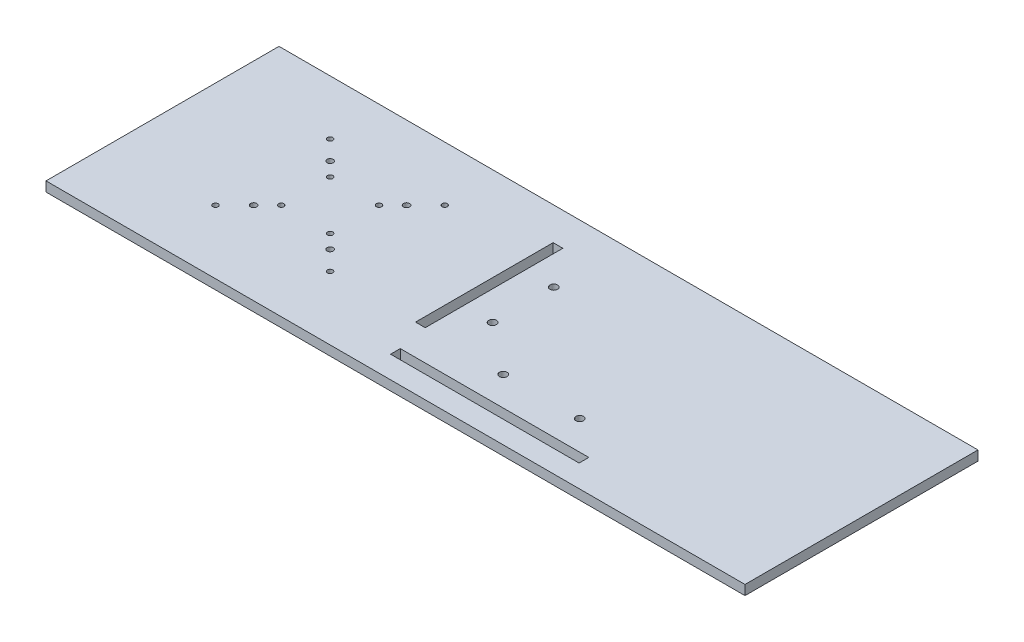
ISO-10303-21;
HEADER;
FILE_DESCRIPTION(('STEP AP214'),'2;1');
FILE_NAME('part.step','',(''),(''),'','','');
FILE_SCHEMA(('AUTOMOTIVE_DESIGN { 1 0 10303 214 1 1 1 1 }'));
ENDSEC;
DATA;
#1=APPLICATION_CONTEXT('core data for automotive mechanical design processes');
#2=APPLICATION_PROTOCOL_DEFINITION('international standard','automotive_design',2000,#1);
#3=PRODUCT_CONTEXT('',#1,'mechanical');
#4=PRODUCT('Part','Part','',(#3));
#5=PRODUCT_RELATED_PRODUCT_CATEGORY('part','',(#4));
#6=PRODUCT_DEFINITION_FORMATION('','',#4);
#7=PRODUCT_DEFINITION_CONTEXT('part definition',#1,'design');
#8=PRODUCT_DEFINITION('design','',#6,#7);
#9=PRODUCT_DEFINITION_SHAPE('','',#8);
#10=(LENGTH_UNIT() NAMED_UNIT(*) SI_UNIT(.MILLI.,.METRE.));
#11=(NAMED_UNIT(*) PLANE_ANGLE_UNIT() SI_UNIT($,.RADIAN.));
#12=(NAMED_UNIT(*) SI_UNIT($,.STERADIAN.) SOLID_ANGLE_UNIT());
#13=UNCERTAINTY_MEASURE_WITH_UNIT(LENGTH_MEASURE(1.E-05),#10,'distance_accuracy_value','');
#14=(GEOMETRIC_REPRESENTATION_CONTEXT(3) GLOBAL_UNCERTAINTY_ASSIGNED_CONTEXT((#13)) GLOBAL_UNIT_ASSIGNED_CONTEXT((#10,
#11,#12)) REPRESENTATION_CONTEXT('',''));
#15=CARTESIAN_POINT('',(0.,0.,0.));
#16=DIRECTION('',(0.,0.,1.));
#17=DIRECTION('',(1.,0.,0.));
#18=AXIS2_PLACEMENT_3D('',#15,#16,#17);
#19=CARTESIAN_POINT('',(0.,6.35,0.));
#20=DIRECTION('',(0.,-1.,0.));
#21=DIRECTION('',(0.,0.,-1.));
#22=AXIS2_PLACEMENT_3D('',#19,#20,#21);
#23=PLANE('',#22);
#24=CARTESIAN_POINT('',(69.2025812842571,6.35,-41.6299999999999));
#25=DIRECTION('',(0.,1.,0.));
#26=DIRECTION('',(0.,0.,1.));
#27=AXIS2_PLACEMENT_3D('',#24,#25,#26);
#28=CIRCLE('',#27,1.74999999999944);
#29=CARTESIAN_POINT('',(69.2025812842571,6.35,-39.8800000000005));
#30=VERTEX_POINT('',#29);
#31=EDGE_CURVE('E180',#30,#30,#28,.T.);
#32=ORIENTED_EDGE('',*,*,#31,.F.);
#33=EDGE_LOOP('',(#32));
#34=FACE_BOUND('',#33,.T.);
#35=CARTESIAN_POINT('',(144.202581284257,6.35,-41.6299999999999));
#36=DIRECTION('',(0.,1.,0.));
#37=DIRECTION('',(0.,0.,1.));
#38=AXIS2_PLACEMENT_3D('',#35,#36,#37);
#39=CIRCLE('',#38,1.74999999999946);
#40=CARTESIAN_POINT('',(144.202581284257,6.35,-39.8800000000005));
#41=VERTEX_POINT('',#40);
#42=EDGE_CURVE('E188',#41,#41,#39,.T.);
#43=ORIENTED_EDGE('',*,*,#42,.F.);
#44=EDGE_LOOP('',(#43));
#45=FACE_BOUND('',#44,.T.);
#46=CARTESIAN_POINT('',(69.202581284257,6.35,-116.63));
#47=DIRECTION('',(0.,1.,0.));
#48=DIRECTION('',(0.,0.,1.));
#49=AXIS2_PLACEMENT_3D('',#46,#47,#48);
#50=CIRCLE('',#49,1.74999999999926);
#51=CARTESIAN_POINT('',(69.202581284257,6.35,-114.88));
#52=VERTEX_POINT('',#51);
#53=EDGE_CURVE('E196',#52,#52,#50,.T.);
#54=ORIENTED_EDGE('',*,*,#53,.F.);
#55=EDGE_LOOP('',(#54));
#56=FACE_BOUND('',#55,.T.);
#57=CARTESIAN_POINT('',(144.202581284257,6.35,-116.63));
#58=DIRECTION('',(0.,1.,0.));
#59=DIRECTION('',(0.,0.,1.));
#60=AXIS2_PLACEMENT_3D('',#57,#58,#59);
#61=CIRCLE('',#60,1.74999999999949);
#62=CARTESIAN_POINT('',(144.202581284257,6.35,-114.88));
#63=VERTEX_POINT('',#62);
#64=EDGE_CURVE('E204',#63,#63,#61,.T.);
#65=ORIENTED_EDGE('',*,*,#64,.F.);
#66=EDGE_LOOP('',(#65));
#67=FACE_BOUND('',#66,.T.);
#68=DIRECTION('',(0.,0.,1.));
#69=VECTOR('',#68,1.);
#70=CARTESIAN_POINT('',(200.85,6.35,-130.86));
#71=LINE('',#70,#69);
#72=CARTESIAN_POINT('',(200.85,6.35,-130.86));
#73=VERTEX_POINT('',#72);
#74=CARTESIAN_POINT('',(200.85,6.35,-40.8600000000001));
#75=VERTEX_POINT('',#74);
#76=EDGE_CURVE('E212',#73,#75,#71,.T.);
#77=ORIENTED_EDGE('',*,*,#76,.F.);
#78=DIRECTION('',(-1.,0.,0.));
#79=VECTOR('',#78,1.);
#80=CARTESIAN_POINT('',(207.2,6.35,-130.86));
#81=LINE('',#80,#79);
#82=CARTESIAN_POINT('',(207.2,6.35,-130.86));
#83=VERTEX_POINT('',#82);
#84=EDGE_CURVE('E223',#83,#73,#81,.T.);
#85=ORIENTED_EDGE('',*,*,#84,.F.);
#86=DIRECTION('',(0.,0.,-1.));
#87=VECTOR('',#86,1.);
#88=CARTESIAN_POINT('',(207.2,6.35,-130.86));
#89=LINE('',#88,#87);
#90=CARTESIAN_POINT('',(207.2,6.35,-40.8600000000001));
#91=VERTEX_POINT('',#90);
#92=EDGE_CURVE('E219',#91,#83,#89,.T.);
#93=ORIENTED_EDGE('',*,*,#92,.F.);
#94=DIRECTION('',(1.,0.,0.));
#95=VECTOR('',#94,1.);
#96=CARTESIAN_POINT('',(207.2,6.35,-40.8600000000001));
#97=LINE('',#96,#95);
#98=EDGE_CURVE('E215',#75,#91,#97,.T.);
#99=ORIENTED_EDGE('',*,*,#98,.F.);
#100=EDGE_LOOP('',(#77,#85,#93,#99));
#101=FACE_BOUND('',#100,.T.);
#102=DIRECTION('',(0.,0.,1.));
#103=VECTOR('',#102,1.);
#104=CARTESIAN_POINT('',(0.,6.35,0.));
#105=LINE('',#104,#103);
#106=CARTESIAN_POINT('',(0.,6.35,-152.4));
#107=VERTEX_POINT('',#106);
#108=CARTESIAN_POINT('',(0.,6.35,0.));
#109=VERTEX_POINT('',#108);
#110=EDGE_CURVE('E287',#107,#109,#105,.T.);
#111=ORIENTED_EDGE('',*,*,#110,.T.);
#112=DIRECTION('',(1.,0.,0.));
#113=VECTOR('',#112,1.);
#114=CARTESIAN_POINT('',(0.,6.35,0.));
#115=LINE('',#114,#113);
#116=CARTESIAN_POINT('',(457.2,6.35,0.));
#117=VERTEX_POINT('',#116);
#118=EDGE_CURVE('E291',#109,#117,#115,.T.);
#119=ORIENTED_EDGE('',*,*,#118,.T.);
#120=DIRECTION('',(0.,0.,-1.));
#121=VECTOR('',#120,1.);
#122=CARTESIAN_POINT('',(457.2,6.35,0.));
#123=LINE('',#122,#121);
#124=CARTESIAN_POINT('',(457.2,6.35,-152.4));
#125=VERTEX_POINT('',#124);
#126=EDGE_CURVE('E295',#117,#125,#123,.T.);
#127=ORIENTED_EDGE('',*,*,#126,.T.);
#128=DIRECTION('',(-1.,0.,0.));
#129=VECTOR('',#128,1.);
#130=CARTESIAN_POINT('',(0.,6.35,-152.4));
#131=LINE('',#130,#129);
#132=EDGE_CURVE('E298',#125,#107,#131,.T.);
#133=ORIENTED_EDGE('',*,*,#132,.T.);
#134=EDGE_LOOP('',(#111,#119,#127,#133));
#135=FACE_BOUND('',#134,.T.);
#136=CARTESIAN_POINT('',(90.702581284257,6.35,-95.13));
#137=DIRECTION('',(0.,1.,0.));
#138=DIRECTION('',(0.,0.,1.));
#139=AXIS2_PLACEMENT_3D('',#136,#137,#138);
#140=CIRCLE('',#139,1.74999999999946);
#141=CARTESIAN_POINT('',(90.702581284257,6.35,-93.3800000000005));
#142=VERTEX_POINT('',#141);
#143=EDGE_CURVE('E279',#142,#142,#140,.T.);
#144=ORIENTED_EDGE('',*,*,#143,.F.);
#145=EDGE_LOOP('',(#144));
#146=FACE_BOUND('',#145,.T.);
#147=CARTESIAN_POINT('',(122.702581284257,6.35,-95.1299999999999));
#148=DIRECTION('',(0.,1.,0.));
#149=DIRECTION('',(0.,0.,1.));
#150=AXIS2_PLACEMENT_3D('',#147,#148,#149);
#151=CIRCLE('',#150,1.74999999999952);
#152=CARTESIAN_POINT('',(122.702581284257,6.35,-93.3800000000003));
#153=VERTEX_POINT('',#152);
#154=EDGE_CURVE('E271',#153,#153,#151,.T.);
#155=ORIENTED_EDGE('',*,*,#154,.F.);
#156=EDGE_LOOP('',(#155));
#157=FACE_BOUND('',#156,.T.);
#158=CARTESIAN_POINT('',(122.702581284257,6.35,-63.13));
#159=DIRECTION('',(0.,1.,0.));
#160=DIRECTION('',(0.,0.,1.));
#161=AXIS2_PLACEMENT_3D('',#158,#159,#160);
#162=CIRCLE('',#161,1.74999999999975);
#163=CARTESIAN_POINT('',(122.702581284257,6.35,-61.3800000000002));
#164=VERTEX_POINT('',#163);
#165=EDGE_CURVE('E263',#164,#164,#162,.T.);
#166=ORIENTED_EDGE('',*,*,#165,.F.);
#167=EDGE_LOOP('',(#166));
#168=FACE_BOUND('',#167,.T.);
#169=CARTESIAN_POINT('',(90.702581284257,6.35,-63.1300000000001));
#170=DIRECTION('',(0.,1.,0.));
#171=DIRECTION('',(0.,0.,1.));
#172=AXIS2_PLACEMENT_3D('',#169,#170,#171);
#173=CIRCLE('',#172,1.74999999999969);
#174=CARTESIAN_POINT('',(90.702581284257,6.35,-61.3800000000004));
#175=VERTEX_POINT('',#174);
#176=EDGE_CURVE('E255',#175,#175,#173,.T.);
#177=ORIENTED_EDGE('',*,*,#176,.F.);
#178=EDGE_LOOP('',(#177));
#179=FACE_BOUND('',#178,.T.);
#180=DIRECTION('',(0.,0.,1.));
#181=VECTOR('',#180,1.);
#182=CARTESIAN_POINT('',(210.85,6.35,-20.8600000000001));
#183=LINE('',#182,#181);
#184=CARTESIAN_POINT('',(210.85,6.35,-20.8600000000001));
#185=VERTEX_POINT('',#184);
#186=CARTESIAN_POINT('',(210.85,6.35,-14.5100000000001));
#187=VERTEX_POINT('',#186);
#188=EDGE_CURVE('E129',#185,#187,#183,.T.);
#189=ORIENTED_EDGE('',*,*,#188,.F.);
#190=DIRECTION('',(-1.,0.,0.));
#191=VECTOR('',#190,1.);
#192=CARTESIAN_POINT('',(210.85,6.35,-20.8600000000001));
#193=LINE('',#192,#191);
#194=CARTESIAN_POINT('',(334.17,6.35,-20.8600000000001));
#195=VERTEX_POINT('',#194);
#196=EDGE_CURVE('E156',#195,#185,#193,.T.);
#197=ORIENTED_EDGE('',*,*,#196,.F.);
#198=DIRECTION('',(0.,0.,-1.));
#199=VECTOR('',#198,1.);
#200=CARTESIAN_POINT('',(334.17,6.35,-20.8600000000001));
#201=LINE('',#200,#199);
#202=CARTESIAN_POINT('',(334.17,6.35,-14.5100000000001));
#203=VERTEX_POINT('',#202);
#204=EDGE_CURVE('E152',#203,#195,#201,.T.);
#205=ORIENTED_EDGE('',*,*,#204,.F.);
#206=DIRECTION('',(1.,0.,0.));
#207=VECTOR('',#206,1.);
#208=CARTESIAN_POINT('',(210.85,6.35,-14.5100000000001));
#209=LINE('',#208,#207);
#210=EDGE_CURVE('E138',#187,#203,#209,.T.);
#211=ORIENTED_EDGE('',*,*,#210,.F.);
#212=EDGE_LOOP('',(#189,#197,#205,#211));
#213=FACE_BOUND('',#212,.T.);
#214=CARTESIAN_POINT('',(226.25,6.35,-65.8600000000001));
#215=DIRECTION('',(0.,1.,0.));
#216=DIRECTION('',(0.,0.,1.));
#217=AXIS2_PLACEMENT_3D('',#214,#215,#216);
#218=CIRCLE('',#217,2.50000000000014);
#219=CARTESIAN_POINT('',(226.25,6.35,-63.3599999999999));
#220=VERTEX_POINT('',#219);
#221=EDGE_CURVE('E164',#220,#220,#218,.T.);
#222=ORIENTED_EDGE('',*,*,#221,.F.);
#223=EDGE_LOOP('',(#222));
#224=FACE_BOUND('',#223,.T.);
#225=CARTESIAN_POINT('',(226.25,6.35,-105.86));
#226=DIRECTION('',(0.,1.,0.));
#227=DIRECTION('',(0.,0.,1.));
#228=AXIS2_PLACEMENT_3D('',#225,#226,#227);
#229=CIRCLE('',#228,2.50000000000014);
#230=CARTESIAN_POINT('',(226.25,6.35,-103.36));
#231=VERTEX_POINT('',#230);
#232=EDGE_CURVE('E459',#231,#231,#229,.T.);
#233=ORIENTED_EDGE('',*,*,#232,.F.);
#234=EDGE_LOOP('',(#233));
#235=FACE_BOUND('',#234,.T.);
#236=CARTESIAN_POINT('',(259.17,6.35,-39.9100000000001));
#237=DIRECTION('',(0.,1.,0.));
#238=DIRECTION('',(0.,0.,1.));
#239=AXIS2_PLACEMENT_3D('',#236,#237,#238);
#240=CIRCLE('',#239,2.50000000000002);
#241=CARTESIAN_POINT('',(259.17,6.35,-37.41));
#242=VERTEX_POINT('',#241);
#243=EDGE_CURVE('E452',#242,#242,#240,.T.);
#244=ORIENTED_EDGE('',*,*,#243,.F.);
#245=EDGE_LOOP('',(#244));
#246=FACE_BOUND('',#245,.T.);
#247=CARTESIAN_POINT('',(309.17,6.35,-39.9100000000001));
#248=DIRECTION('',(0.,1.,0.));
#249=DIRECTION('',(0.,0.,1.));
#250=AXIS2_PLACEMENT_3D('',#247,#248,#249);
#251=CIRCLE('',#250,2.50000000000002);
#252=CARTESIAN_POINT('',(309.17,6.35,-37.41));
#253=VERTEX_POINT('',#252);
#254=EDGE_CURVE('E445',#253,#253,#251,.T.);
#255=ORIENTED_EDGE('',*,*,#254,.F.);
#256=EDGE_LOOP('',(#255));
#257=FACE_BOUND('',#256,.T.);
#258=CARTESIAN_POINT('',(81.702581284257,6.35,-104.13));
#259=DIRECTION('',(0.,1.,0.));
#260=DIRECTION('',(0.,0.,1.));
#261=AXIS2_PLACEMENT_3D('',#258,#259,#260);
#262=CIRCLE('',#261,2.);
#263=CARTESIAN_POINT('',(81.702581284257,6.35,-102.13));
#264=VERTEX_POINT('',#263);
#265=EDGE_CURVE('E438',#264,#264,#262,.T.);
#266=ORIENTED_EDGE('',*,*,#265,.F.);
#267=EDGE_LOOP('',(#266));
#268=FACE_BOUND('',#267,.T.);
#269=CARTESIAN_POINT('',(131.702581284257,6.35,-104.13));
#270=DIRECTION('',(0.,1.,0.));
#271=DIRECTION('',(0.,0.,1.));
#272=AXIS2_PLACEMENT_3D('',#269,#270,#271);
#273=CIRCLE('',#272,2.);
#274=CARTESIAN_POINT('',(131.702581284257,6.35,-102.13));
#275=VERTEX_POINT('',#274);
#276=EDGE_CURVE('E431',#275,#275,#273,.T.);
#277=ORIENTED_EDGE('',*,*,#276,.F.);
#278=EDGE_LOOP('',(#277));
#279=FACE_BOUND('',#278,.T.);
#280=CARTESIAN_POINT('',(131.702581284257,6.35,-54.1299999999999));
#281=DIRECTION('',(0.,1.,0.));
#282=DIRECTION('',(0.,0.,1.));
#283=AXIS2_PLACEMENT_3D('',#280,#281,#282);
#284=CIRCLE('',#283,2.);
#285=CARTESIAN_POINT('',(131.702581284257,6.35,-52.1299999999999));
#286=VERTEX_POINT('',#285);
#287=EDGE_CURVE('E424',#286,#286,#284,.T.);
#288=ORIENTED_EDGE('',*,*,#287,.F.);
#289=EDGE_LOOP('',(#288));
#290=FACE_BOUND('',#289,.T.);
#291=CARTESIAN_POINT('',(81.7025812842575,6.35,-54.1299999999999));
#292=DIRECTION('',(0.,1.,0.));
#293=DIRECTION('',(0.,0.,1.));
#294=AXIS2_PLACEMENT_3D('',#291,#292,#293);
#295=CIRCLE('',#294,2.);
#296=CARTESIAN_POINT('',(81.7025812842575,6.35,-52.1299999999999));
#297=VERTEX_POINT('',#296);
#298=EDGE_CURVE('E417',#297,#297,#295,.T.);
#299=ORIENTED_EDGE('',*,*,#298,.F.);
#300=EDGE_LOOP('',(#299));
#301=FACE_BOUND('',#300,.T.);
#302=ADVANCED_FACE('F39',(#34,#45,#56,#67,#101,#135,#146,#157,#168,#179,#213,#224,#235,#246,
#257,#268,#279,#290,#301),#23,.F.);
#303=CARTESIAN_POINT('',(0.,0.,0.));
#304=DIRECTION('',(0.,-1.,0.));
#305=DIRECTION('',(0.,0.,-1.));
#306=AXIS2_PLACEMENT_3D('',#303,#304,#305);
#307=PLANE('',#306);
#308=CARTESIAN_POINT('',(131.702581284257,0.,-54.1299999999999));
#309=DIRECTION('',(0.,1.,0.));
#310=DIRECTION('',(0.,0.,1.));
#311=AXIS2_PLACEMENT_3D('',#308,#309,#310);
#312=CIRCLE('',#311,2.);
#313=CARTESIAN_POINT('',(131.702581284257,0.,-52.1299999999999));
#314=VERTEX_POINT('',#313);
#315=EDGE_CURVE('E421',#314,#314,#312,.T.);
#316=ORIENTED_EDGE('',*,*,#315,.T.);
#317=EDGE_LOOP('',(#316));
#318=FACE_BOUND('',#317,.T.);
#319=CARTESIAN_POINT('',(81.702581284257,0.,-104.13));
#320=DIRECTION('',(0.,1.,0.));
#321=DIRECTION('',(0.,0.,1.));
#322=AXIS2_PLACEMENT_3D('',#319,#320,#321);
#323=CIRCLE('',#322,2.);
#324=CARTESIAN_POINT('',(81.702581284257,0.,-102.13));
#325=VERTEX_POINT('',#324);
#326=EDGE_CURVE('E435',#325,#325,#323,.T.);
#327=ORIENTED_EDGE('',*,*,#326,.T.);
#328=EDGE_LOOP('',(#327));
#329=FACE_BOUND('',#328,.T.);
#330=CARTESIAN_POINT('',(259.17,0.,-39.9100000000001));
#331=DIRECTION('',(0.,1.,0.));
#332=DIRECTION('',(0.,0.,1.));
#333=AXIS2_PLACEMENT_3D('',#330,#331,#332);
#334=CIRCLE('',#333,2.50000000000002);
#335=CARTESIAN_POINT('',(259.17,0.,-37.41));
#336=VERTEX_POINT('',#335);
#337=EDGE_CURVE('E449',#336,#336,#334,.T.);
#338=ORIENTED_EDGE('',*,*,#337,.T.);
#339=EDGE_LOOP('',(#338));
#340=FACE_BOUND('',#339,.T.);
#341=CARTESIAN_POINT('',(226.25,0.,-65.8600000000001));
#342=DIRECTION('',(0.,1.,0.));
#343=DIRECTION('',(0.,0.,1.));
#344=AXIS2_PLACEMENT_3D('',#341,#342,#343);
#345=CIRCLE('',#344,2.50000000000014);
#346=CARTESIAN_POINT('',(226.25,0.,-63.3599999999999));
#347=VERTEX_POINT('',#346);
#348=EDGE_CURVE('E463',#347,#347,#345,.T.);
#349=ORIENTED_EDGE('',*,*,#348,.T.);
#350=EDGE_LOOP('',(#349));
#351=FACE_BOUND('',#350,.T.);
#352=CARTESIAN_POINT('',(144.202581284257,0.,-41.6299999999999));
#353=DIRECTION('',(0.,1.,0.));
#354=DIRECTION('',(0.,0.,1.));
#355=AXIS2_PLACEMENT_3D('',#352,#353,#354);
#356=CIRCLE('',#355,1.74999999999946);
#357=CARTESIAN_POINT('',(144.202581284257,0.,-39.8800000000005));
#358=VERTEX_POINT('',#357);
#359=EDGE_CURVE('E184',#358,#358,#356,.T.);
#360=ORIENTED_EDGE('',*,*,#359,.T.);
#361=EDGE_LOOP('',(#360));
#362=FACE_BOUND('',#361,.T.);
#363=CARTESIAN_POINT('',(144.202581284257,0.,-116.63));
#364=DIRECTION('',(0.,1.,0.));
#365=DIRECTION('',(0.,0.,1.));
#366=AXIS2_PLACEMENT_3D('',#363,#364,#365);
#367=CIRCLE('',#366,1.74999999999949);
#368=CARTESIAN_POINT('',(144.202581284257,0.,-114.88));
#369=VERTEX_POINT('',#368);
#370=EDGE_CURVE('E200',#369,#369,#367,.T.);
#371=ORIENTED_EDGE('',*,*,#370,.T.);
#372=EDGE_LOOP('',(#371));
#373=FACE_BOUND('',#372,.T.);
#374=CARTESIAN_POINT('',(122.702581284257,0.,-63.13));
#375=DIRECTION('',(0.,1.,0.));
#376=DIRECTION('',(0.,0.,1.));
#377=AXIS2_PLACEMENT_3D('',#374,#375,#376);
#378=CIRCLE('',#377,1.74999999999975);
#379=CARTESIAN_POINT('',(122.702581284257,0.,-61.3800000000002));
#380=VERTEX_POINT('',#379);
#381=EDGE_CURVE('E259',#380,#380,#378,.T.);
#382=ORIENTED_EDGE('',*,*,#381,.T.);
#383=EDGE_LOOP('',(#382));
#384=FACE_BOUND('',#383,.T.);
#385=CARTESIAN_POINT('',(90.702581284257,0.,-95.13));
#386=DIRECTION('',(0.,1.,0.));
#387=DIRECTION('',(0.,0.,1.));
#388=AXIS2_PLACEMENT_3D('',#385,#386,#387);
#389=CIRCLE('',#388,1.74999999999946);
#390=CARTESIAN_POINT('',(90.702581284257,0.,-93.3800000000005));
#391=VERTEX_POINT('',#390);
#392=EDGE_CURVE('E275',#391,#391,#389,.T.);
#393=ORIENTED_EDGE('',*,*,#392,.T.);
#394=EDGE_LOOP('',(#393));
#395=FACE_BOUND('',#394,.T.);
#396=DIRECTION('',(0.,0.,1.));
#397=VECTOR('',#396,1.);
#398=CARTESIAN_POINT('',(0.,0.,0.));
#399=LINE('',#398,#397);
#400=CARTESIAN_POINT('',(0.,0.,-152.4));
#401=VERTEX_POINT('',#400);
#402=CARTESIAN_POINT('',(0.,0.,0.));
#403=VERTEX_POINT('',#402);
#404=EDGE_CURVE('E283',#401,#403,#399,.T.);
#405=ORIENTED_EDGE('',*,*,#404,.F.);
#406=DIRECTION('',(-1.,0.,0.));
#407=VECTOR('',#406,1.);
#408=CARTESIAN_POINT('',(0.,0.,-152.4));
#409=LINE('',#408,#407);
#410=CARTESIAN_POINT('',(457.2,0.,-152.4));
#411=VERTEX_POINT('',#410);
#412=EDGE_CURVE('E292',#411,#401,#409,.T.);
#413=ORIENTED_EDGE('',*,*,#412,.F.);
#414=DIRECTION('',(0.,0.,-1.));
#415=VECTOR('',#414,1.);
#416=CARTESIAN_POINT('',(457.2,0.,0.));
#417=LINE('',#416,#415);
#418=CARTESIAN_POINT('',(457.2,0.,0.));
#419=VERTEX_POINT('',#418);
#420=EDGE_CURVE('E308',#419,#411,#417,.T.);
#421=ORIENTED_EDGE('',*,*,#420,.F.);
#422=DIRECTION('',(1.,0.,0.));
#423=VECTOR('',#422,1.);
#424=CARTESIAN_POINT('',(0.,0.,0.));
#425=LINE('',#424,#423);
#426=EDGE_CURVE('E305',#403,#419,#425,.T.);
#427=ORIENTED_EDGE('',*,*,#426,.F.);
#428=EDGE_LOOP('',(#405,#413,#421,#427));
#429=FACE_BOUND('',#428,.T.);
#430=CARTESIAN_POINT('',(122.702581284257,0.,-95.1299999999999));
#431=DIRECTION('',(0.,1.,0.));
#432=DIRECTION('',(0.,0.,1.));
#433=AXIS2_PLACEMENT_3D('',#430,#431,#432);
#434=CIRCLE('',#433,1.74999999999952);
#435=CARTESIAN_POINT('',(122.702581284257,0.,-93.3800000000003));
#436=VERTEX_POINT('',#435);
#437=EDGE_CURVE('E267',#436,#436,#434,.T.);
#438=ORIENTED_EDGE('',*,*,#437,.T.);
#439=EDGE_LOOP('',(#438));
#440=FACE_BOUND('',#439,.T.);
#441=CARTESIAN_POINT('',(90.702581284257,0.,-63.1300000000001));
#442=DIRECTION('',(0.,1.,0.));
#443=DIRECTION('',(0.,0.,1.));
#444=AXIS2_PLACEMENT_3D('',#441,#442,#443);
#445=CIRCLE('',#444,1.74999999999969);
#446=CARTESIAN_POINT('',(90.702581284257,0.,-61.3800000000004));
#447=VERTEX_POINT('',#446);
#448=EDGE_CURVE('E254',#447,#447,#445,.T.);
#449=ORIENTED_EDGE('',*,*,#448,.T.);
#450=EDGE_LOOP('',(#449));
#451=FACE_BOUND('',#450,.T.);
#452=DIRECTION('',(-1.,0.,0.));
#453=VECTOR('',#452,1.);
#454=CARTESIAN_POINT('',(207.2,0.,-130.86));
#455=LINE('',#454,#453);
#456=CARTESIAN_POINT('',(207.2,0.,-130.86));
#457=VERTEX_POINT('',#456);
#458=CARTESIAN_POINT('',(200.85,0.,-130.86));
#459=VERTEX_POINT('',#458);
#460=EDGE_CURVE('E216',#457,#459,#455,.T.);
#461=ORIENTED_EDGE('',*,*,#460,.T.);
#462=DIRECTION('',(0.,0.,1.));
#463=VECTOR('',#462,1.);
#464=CARTESIAN_POINT('',(200.85,0.,-130.86));
#465=LINE('',#464,#463);
#466=CARTESIAN_POINT('',(200.85,0.,-40.8600000000001));
#467=VERTEX_POINT('',#466);
#468=EDGE_CURVE('E208',#459,#467,#465,.T.);
#469=ORIENTED_EDGE('',*,*,#468,.T.);
#470=DIRECTION('',(1.,0.,0.));
#471=VECTOR('',#470,1.);
#472=CARTESIAN_POINT('',(207.2,0.,-40.8600000000001));
#473=LINE('',#472,#471);
#474=CARTESIAN_POINT('',(207.2,0.,-40.8600000000001));
#475=VERTEX_POINT('',#474);
#476=EDGE_CURVE('E230',#467,#475,#473,.T.);
#477=ORIENTED_EDGE('',*,*,#476,.T.);
#478=DIRECTION('',(0.,0.,-1.));
#479=VECTOR('',#478,1.);
#480=CARTESIAN_POINT('',(207.2,0.,-130.86));
#481=LINE('',#480,#479);
#482=EDGE_CURVE('E234',#475,#457,#481,.T.);
#483=ORIENTED_EDGE('',*,*,#482,.T.);
#484=EDGE_LOOP('',(#461,#469,#477,#483));
#485=FACE_BOUND('',#484,.T.);
#486=CARTESIAN_POINT('',(69.202581284257,0.,-116.63));
#487=DIRECTION('',(0.,1.,0.));
#488=DIRECTION('',(0.,0.,1.));
#489=AXIS2_PLACEMENT_3D('',#486,#487,#488);
#490=CIRCLE('',#489,1.74999999999926);
#491=CARTESIAN_POINT('',(69.202581284257,0.,-114.88));
#492=VERTEX_POINT('',#491);
#493=EDGE_CURVE('E192',#492,#492,#490,.T.);
#494=ORIENTED_EDGE('',*,*,#493,.T.);
#495=EDGE_LOOP('',(#494));
#496=FACE_BOUND('',#495,.T.);
#497=CARTESIAN_POINT('',(69.2025812842571,0.,-41.6299999999999));
#498=DIRECTION('',(0.,1.,0.));
#499=DIRECTION('',(0.,0.,1.));
#500=AXIS2_PLACEMENT_3D('',#497,#498,#499);
#501=CIRCLE('',#500,1.74999999999944);
#502=CARTESIAN_POINT('',(69.2025812842571,0.,-39.8800000000005));
#503=VERTEX_POINT('',#502);
#504=EDGE_CURVE('E147',#503,#503,#501,.T.);
#505=ORIENTED_EDGE('',*,*,#504,.T.);
#506=EDGE_LOOP('',(#505));
#507=FACE_BOUND('',#506,.T.);
#508=DIRECTION('',(-1.,0.,0.));
#509=VECTOR('',#508,1.);
#510=CARTESIAN_POINT('',(210.85,0.,-20.8600000000001));
#511=LINE('',#510,#509);
#512=CARTESIAN_POINT('',(334.17,0.,-20.8600000000001));
#513=VERTEX_POINT('',#512);
#514=CARTESIAN_POINT('',(210.85,0.,-20.8600000000001));
#515=VERTEX_POINT('',#514);
#516=EDGE_CURVE('E139',#513,#515,#511,.T.);
#517=ORIENTED_EDGE('',*,*,#516,.T.);
#518=DIRECTION('',(0.,0.,1.));
#519=VECTOR('',#518,1.);
#520=CARTESIAN_POINT('',(210.85,0.,-20.8600000000001));
#521=LINE('',#520,#519);
#522=CARTESIAN_POINT('',(210.85,0.,-14.5100000000001));
#523=VERTEX_POINT('',#522);
#524=EDGE_CURVE('E63',#515,#523,#521,.T.);
#525=ORIENTED_EDGE('',*,*,#524,.T.);
#526=DIRECTION('',(1.,0.,0.));
#527=VECTOR('',#526,1.);
#528=CARTESIAN_POINT('',(210.85,0.,-14.5100000000001));
#529=LINE('',#528,#527);
#530=CARTESIAN_POINT('',(334.17,0.,-14.5100000000001));
#531=VERTEX_POINT('',#530);
#532=EDGE_CURVE('E145',#523,#531,#529,.T.);
#533=ORIENTED_EDGE('',*,*,#532,.T.);
#534=DIRECTION('',(0.,0.,-1.));
#535=VECTOR('',#534,1.);
#536=CARTESIAN_POINT('',(334.17,0.,-20.8600000000001));
#537=LINE('',#536,#535);
#538=EDGE_CURVE('E167',#531,#513,#537,.T.);
#539=ORIENTED_EDGE('',*,*,#538,.T.);
#540=EDGE_LOOP('',(#517,#525,#533,#539));
#541=FACE_BOUND('',#540,.T.);
#542=CARTESIAN_POINT('',(226.25,0.,-105.86));
#543=DIRECTION('',(0.,1.,0.));
#544=DIRECTION('',(0.,0.,1.));
#545=AXIS2_PLACEMENT_3D('',#542,#543,#544);
#546=CIRCLE('',#545,2.50000000000014);
#547=CARTESIAN_POINT('',(226.25,0.,-103.36));
#548=VERTEX_POINT('',#547);
#549=EDGE_CURVE('E403',#548,#548,#546,.T.);
#550=ORIENTED_EDGE('',*,*,#549,.T.);
#551=EDGE_LOOP('',(#550));
#552=FACE_BOUND('',#551,.T.);
#553=CARTESIAN_POINT('',(309.17,0.,-39.9100000000001));
#554=DIRECTION('',(0.,1.,0.));
#555=DIRECTION('',(0.,0.,1.));
#556=AXIS2_PLACEMENT_3D('',#553,#554,#555);
#557=CIRCLE('',#556,2.50000000000002);
#558=CARTESIAN_POINT('',(309.17,0.,-37.41));
#559=VERTEX_POINT('',#558);
#560=EDGE_CURVE('E407',#559,#559,#557,.T.);
#561=ORIENTED_EDGE('',*,*,#560,.T.);
#562=EDGE_LOOP('',(#561));
#563=FACE_BOUND('',#562,.T.);
#564=CARTESIAN_POINT('',(131.702581284257,0.,-104.13));
#565=DIRECTION('',(0.,1.,0.));
#566=DIRECTION('',(0.,0.,1.));
#567=AXIS2_PLACEMENT_3D('',#564,#565,#566);
#568=CIRCLE('',#567,2.);
#569=CARTESIAN_POINT('',(131.702581284257,0.,-102.13));
#570=VERTEX_POINT('',#569);
#571=EDGE_CURVE('E411',#570,#570,#568,.T.);
#572=ORIENTED_EDGE('',*,*,#571,.T.);
#573=EDGE_LOOP('',(#572));
#574=FACE_BOUND('',#573,.T.);
#575=CARTESIAN_POINT('',(81.7025812842575,0.,-54.1299999999999));
#576=DIRECTION('',(0.,1.,0.));
#577=DIRECTION('',(0.,0.,1.));
#578=AXIS2_PLACEMENT_3D('',#575,#576,#577);
#579=CIRCLE('',#578,2.);
#580=CARTESIAN_POINT('',(81.7025812842575,0.,-52.1299999999999));
#581=VERTEX_POINT('',#580);
#582=EDGE_CURVE('E414',#581,#581,#579,.T.);
#583=ORIENTED_EDGE('',*,*,#582,.T.);
#584=EDGE_LOOP('',(#583));
#585=FACE_BOUND('',#584,.T.);
#586=ADVANCED_FACE('F331',(#318,#329,#340,#351,#362,#373,#384,#395,#429,#440,#451,#485,#496,
#507,#541,#552,#563,#574,#585),#307,.T.);
#587=CARTESIAN_POINT('',(0.,6.35,0.));
#588=DIRECTION('',(1.,0.,0.));
#589=DIRECTION('',(0.,0.,-1.));
#590=AXIS2_PLACEMENT_3D('',#587,#588,#589);
#591=PLANE('',#590);
#592=ORIENTED_EDGE('',*,*,#404,.T.);
#593=DIRECTION('',(0.,-1.,0.));
#594=VECTOR('',#593,1.);
#595=CARTESIAN_POINT('',(0.,6.35,0.));
#596=LINE('',#595,#594);
#597=EDGE_CURVE('E11',#109,#403,#596,.T.);
#598=ORIENTED_EDGE('',*,*,#597,.F.);
#599=ORIENTED_EDGE('',*,*,#110,.F.);
#600=DIRECTION('',(0.,-1.,0.));
#601=VECTOR('',#600,1.);
#602=CARTESIAN_POINT('',(0.,6.35,-152.4));
#603=LINE('',#602,#601);
#604=EDGE_CURVE('E301',#107,#401,#603,.T.);
#605=ORIENTED_EDGE('',*,*,#604,.T.);
#606=EDGE_LOOP('',(#592,#598,#599,#605));
#607=FACE_BOUND('',#606,.T.);
#608=ADVANCED_FACE('F41',(#607),#591,.F.);
#609=CARTESIAN_POINT('',(0.,6.35,0.));
#610=DIRECTION('',(0.,0.,-1.));
#611=DIRECTION('',(-1.,0.,0.));
#612=AXIS2_PLACEMENT_3D('',#609,#610,#611);
#613=PLANE('',#612);
#614=ORIENTED_EDGE('',*,*,#426,.T.);
#615=DIRECTION('',(0.,-1.,0.));
#616=VECTOR('',#615,1.);
#617=CARTESIAN_POINT('',(457.2,6.35,0.));
#618=LINE('',#617,#616);
#619=EDGE_CURVE('E48',#117,#419,#618,.T.);
#620=ORIENTED_EDGE('',*,*,#619,.F.);
#621=ORIENTED_EDGE('',*,*,#118,.F.);
#622=ORIENTED_EDGE('',*,*,#597,.T.);
#623=EDGE_LOOP('',(#614,#620,#621,#622));
#624=FACE_BOUND('',#623,.T.);
#625=ADVANCED_FACE('F342',(#624),#613,.F.);
#626=CARTESIAN_POINT('',(457.2,6.35,0.));
#627=DIRECTION('',(-1.,0.,0.));
#628=DIRECTION('',(0.,0.,1.));
#629=AXIS2_PLACEMENT_3D('',#626,#627,#628);
#630=PLANE('',#629);
#631=ORIENTED_EDGE('',*,*,#420,.T.);
#632=DIRECTION('',(0.,-1.,0.));
#633=VECTOR('',#632,1.);
#634=CARTESIAN_POINT('',(457.2,6.35,-152.4));
#635=LINE('',#634,#633);
#636=EDGE_CURVE('E316',#125,#411,#635,.T.);
#637=ORIENTED_EDGE('',*,*,#636,.F.);
#638=ORIENTED_EDGE('',*,*,#126,.F.);
#639=ORIENTED_EDGE('',*,*,#619,.T.);
#640=EDGE_LOOP('',(#631,#637,#638,#639));
#641=FACE_BOUND('',#640,.T.);
#642=ADVANCED_FACE('F325',(#641),#630,.F.);
#643=CARTESIAN_POINT('',(0.,6.35,-152.4));
#644=DIRECTION('',(0.,0.,1.));
#645=DIRECTION('',(1.,0.,0.));
#646=AXIS2_PLACEMENT_3D('',#643,#644,#645);
#647=PLANE('',#646);
#648=ORIENTED_EDGE('',*,*,#412,.T.);
#649=ORIENTED_EDGE('',*,*,#604,.F.);
#650=ORIENTED_EDGE('',*,*,#132,.F.);
#651=ORIENTED_EDGE('',*,*,#636,.T.);
#652=EDGE_LOOP('',(#648,#649,#650,#651));
#653=FACE_BOUND('',#652,.T.);
#654=ADVANCED_FACE('F335',(#653),#647,.F.);
#655=CARTESIAN_POINT('',(90.702581284257,6.35,-95.13));
#656=DIRECTION('',(0.,-1.,0.));
#657=DIRECTION('',(0.,0.,-1.));
#658=AXIS2_PLACEMENT_3D('',#655,#656,#657);
#659=CYLINDRICAL_SURFACE('',#658,1.74999999999946);
#660=ORIENTED_EDGE('',*,*,#143,.T.);
#661=EDGE_LOOP('',(#660));
#662=FACE_BOUND('',#661,.T.);
#663=ORIENTED_EDGE('',*,*,#392,.F.);
#664=EDGE_LOOP('',(#663));
#665=FACE_BOUND('',#664,.T.);
#666=ADVANCED_FACE('F360',(#662,#665),#659,.F.);
#667=CARTESIAN_POINT('',(122.702581284257,6.35,-95.1299999999999));
#668=DIRECTION('',(0.,-1.,0.));
#669=DIRECTION('',(0.,0.,-1.));
#670=AXIS2_PLACEMENT_3D('',#667,#668,#669);
#671=CYLINDRICAL_SURFACE('',#670,1.74999999999952);
#672=ORIENTED_EDGE('',*,*,#154,.T.);
#673=EDGE_LOOP('',(#672));
#674=FACE_BOUND('',#673,.T.);
#675=ORIENTED_EDGE('',*,*,#437,.F.);
#676=EDGE_LOOP('',(#675));
#677=FACE_BOUND('',#676,.T.);
#678=ADVANCED_FACE('F367',(#674,#677),#671,.F.);
#679=CARTESIAN_POINT('',(122.702581284257,6.35,-63.13));
#680=DIRECTION('',(0.,-1.,0.));
#681=DIRECTION('',(0.,0.,-1.));
#682=AXIS2_PLACEMENT_3D('',#679,#680,#681);
#683=CYLINDRICAL_SURFACE('',#682,1.74999999999975);
#684=ORIENTED_EDGE('',*,*,#165,.T.);
#685=EDGE_LOOP('',(#684));
#686=FACE_BOUND('',#685,.T.);
#687=ORIENTED_EDGE('',*,*,#381,.F.);
#688=EDGE_LOOP('',(#687));
#689=FACE_BOUND('',#688,.T.);
#690=ADVANCED_FACE('F372',(#686,#689),#683,.F.);
#691=CARTESIAN_POINT('',(90.702581284257,6.35,-63.1300000000001));
#692=DIRECTION('',(0.,-1.,0.));
#693=DIRECTION('',(0.,0.,-1.));
#694=AXIS2_PLACEMENT_3D('',#691,#692,#693);
#695=CYLINDRICAL_SURFACE('',#694,1.74999999999969);
#696=ORIENTED_EDGE('',*,*,#176,.T.);
#697=EDGE_LOOP('',(#696));
#698=FACE_BOUND('',#697,.T.);
#699=ORIENTED_EDGE('',*,*,#448,.F.);
#700=EDGE_LOOP('',(#699));
#701=FACE_BOUND('',#700,.T.);
#702=ADVANCED_FACE('F385',(#698,#701),#695,.F.);
#703=CARTESIAN_POINT('',(200.85,6.35,-130.86));
#704=DIRECTION('',(1.,0.,0.));
#705=DIRECTION('',(0.,0.,-1.));
#706=AXIS2_PLACEMENT_3D('',#703,#704,#705);
#707=PLANE('',#706);
#708=ORIENTED_EDGE('',*,*,#468,.F.);
#709=DIRECTION('',(0.,-1.,0.));
#710=VECTOR('',#709,1.);
#711=CARTESIAN_POINT('',(200.85,6.35,-130.86));
#712=LINE('',#711,#710);
#713=EDGE_CURVE('E226',#73,#459,#712,.T.);
#714=ORIENTED_EDGE('',*,*,#713,.F.);
#715=ORIENTED_EDGE('',*,*,#76,.T.);
#716=DIRECTION('',(0.,-1.,0.));
#717=VECTOR('',#716,1.);
#718=CARTESIAN_POINT('',(200.85,6.35,-40.8600000000001));
#719=LINE('',#718,#717);
#720=EDGE_CURVE('E250',#75,#467,#719,.T.);
#721=ORIENTED_EDGE('',*,*,#720,.T.);
#722=EDGE_LOOP('',(#708,#714,#715,#721));
#723=FACE_BOUND('',#722,.T.);
#724=ADVANCED_FACE('F388',(#723),#707,.T.);
#725=CARTESIAN_POINT('',(207.2,6.35,-40.8600000000001));
#726=DIRECTION('',(0.,0.,-1.));
#727=DIRECTION('',(-1.,0.,0.));
#728=AXIS2_PLACEMENT_3D('',#725,#726,#727);
#729=PLANE('',#728);
#730=ORIENTED_EDGE('',*,*,#476,.F.);
#731=ORIENTED_EDGE('',*,*,#720,.F.);
#732=ORIENTED_EDGE('',*,*,#98,.T.);
#733=DIRECTION('',(0.,-1.,0.));
#734=VECTOR('',#733,1.);
#735=CARTESIAN_POINT('',(207.2,6.35,-40.8600000000001));
#736=LINE('',#735,#734);
#737=EDGE_CURVE('E247',#91,#475,#736,.T.);
#738=ORIENTED_EDGE('',*,*,#737,.T.);
#739=EDGE_LOOP('',(#730,#731,#732,#738));
#740=FACE_BOUND('',#739,.T.);
#741=ADVANCED_FACE('F521',(#740),#729,.T.);
#742=CARTESIAN_POINT('',(207.2,6.35,-130.86));
#743=DIRECTION('',(-1.,0.,0.));
#744=DIRECTION('',(0.,0.,1.));
#745=AXIS2_PLACEMENT_3D('',#742,#743,#744);
#746=PLANE('',#745);
#747=ORIENTED_EDGE('',*,*,#482,.F.);
#748=ORIENTED_EDGE('',*,*,#737,.F.);
#749=ORIENTED_EDGE('',*,*,#92,.T.);
#750=DIRECTION('',(0.,-1.,0.));
#751=VECTOR('',#750,1.);
#752=CARTESIAN_POINT('',(207.2,6.35,-130.86));
#753=LINE('',#752,#751);
#754=EDGE_CURVE('E244',#83,#457,#753,.T.);
#755=ORIENTED_EDGE('',*,*,#754,.T.);
#756=EDGE_LOOP('',(#747,#748,#749,#755));
#757=FACE_BOUND('',#756,.T.);
#758=ADVANCED_FACE('F517',(#757),#746,.T.);
#759=CARTESIAN_POINT('',(207.2,6.35,-130.86));
#760=DIRECTION('',(0.,0.,1.));
#761=DIRECTION('',(1.,0.,0.));
#762=AXIS2_PLACEMENT_3D('',#759,#760,#761);
#763=PLANE('',#762);
#764=ORIENTED_EDGE('',*,*,#460,.F.);
#765=ORIENTED_EDGE('',*,*,#754,.F.);
#766=ORIENTED_EDGE('',*,*,#84,.T.);
#767=ORIENTED_EDGE('',*,*,#713,.T.);
#768=EDGE_LOOP('',(#764,#765,#766,#767));
#769=FACE_BOUND('',#768,.T.);
#770=ADVANCED_FACE('F513',(#769),#763,.T.);
#771=CARTESIAN_POINT('',(144.202581284257,6.35,-116.63));
#772=DIRECTION('',(0.,-1.,0.));
#773=DIRECTION('',(0.,0.,-1.));
#774=AXIS2_PLACEMENT_3D('',#771,#772,#773);
#775=CYLINDRICAL_SURFACE('',#774,1.74999999999949);
#776=ORIENTED_EDGE('',*,*,#64,.T.);
#777=EDGE_LOOP('',(#776));
#778=FACE_BOUND('',#777,.T.);
#779=ORIENTED_EDGE('',*,*,#370,.F.);
#780=EDGE_LOOP('',(#779));
#781=FACE_BOUND('',#780,.T.);
#782=ADVANCED_FACE('F509',(#778,#781),#775,.F.);
#783=CARTESIAN_POINT('',(69.202581284257,6.35,-116.63));
#784=DIRECTION('',(0.,-1.,0.));
#785=DIRECTION('',(0.,0.,-1.));
#786=AXIS2_PLACEMENT_3D('',#783,#784,#785);
#787=CYLINDRICAL_SURFACE('',#786,1.74999999999926);
#788=ORIENTED_EDGE('',*,*,#53,.T.);
#789=EDGE_LOOP('',(#788));
#790=FACE_BOUND('',#789,.T.);
#791=ORIENTED_EDGE('',*,*,#493,.F.);
#792=EDGE_LOOP('',(#791));
#793=FACE_BOUND('',#792,.T.);
#794=ADVANCED_FACE('F505',(#790,#793),#787,.F.);
#795=CARTESIAN_POINT('',(144.202581284257,6.35,-41.6299999999999));
#796=DIRECTION('',(0.,-1.,0.));
#797=DIRECTION('',(0.,0.,-1.));
#798=AXIS2_PLACEMENT_3D('',#795,#796,#797);
#799=CYLINDRICAL_SURFACE('',#798,1.74999999999946);
#800=ORIENTED_EDGE('',*,*,#42,.T.);
#801=EDGE_LOOP('',(#800));
#802=FACE_BOUND('',#801,.T.);
#803=ORIENTED_EDGE('',*,*,#359,.F.);
#804=EDGE_LOOP('',(#803));
#805=FACE_BOUND('',#804,.T.);
#806=ADVANCED_FACE('F501',(#802,#805),#799,.F.);
#807=CARTESIAN_POINT('',(69.2025812842571,6.35,-41.6299999999999));
#808=DIRECTION('',(0.,-1.,0.));
#809=DIRECTION('',(0.,0.,-1.));
#810=AXIS2_PLACEMENT_3D('',#807,#808,#809);
#811=CYLINDRICAL_SURFACE('',#810,1.74999999999944);
#812=ORIENTED_EDGE('',*,*,#31,.T.);
#813=EDGE_LOOP('',(#812));
#814=FACE_BOUND('',#813,.T.);
#815=ORIENTED_EDGE('',*,*,#504,.F.);
#816=EDGE_LOOP('',(#815));
#817=FACE_BOUND('',#816,.T.);
#818=ADVANCED_FACE('F498',(#814,#817),#811,.F.);
#819=CARTESIAN_POINT('',(210.85,6.35,-20.8600000000001));
#820=DIRECTION('',(1.,0.,0.));
#821=DIRECTION('',(0.,0.,-1.));
#822=AXIS2_PLACEMENT_3D('',#819,#820,#821);
#823=PLANE('',#822);
#824=ORIENTED_EDGE('',*,*,#524,.F.);
#825=DIRECTION('',(0.,-1.,0.));
#826=VECTOR('',#825,1.);
#827=CARTESIAN_POINT('',(210.85,6.35,-20.8600000000001));
#828=LINE('',#827,#826);
#829=EDGE_CURVE('E133',#185,#515,#828,.T.);
#830=ORIENTED_EDGE('',*,*,#829,.F.);
#831=ORIENTED_EDGE('',*,*,#188,.T.);
#832=DIRECTION('',(0.,-1.,0.));
#833=VECTOR('',#832,1.);
#834=CARTESIAN_POINT('',(210.85,6.35,-14.5100000000001));
#835=LINE('',#834,#833);
#836=EDGE_CURVE('E132',#187,#523,#835,.T.);
#837=ORIENTED_EDGE('',*,*,#836,.T.);
#838=EDGE_LOOP('',(#824,#830,#831,#837));
#839=FACE_BOUND('',#838,.T.);
#840=ADVANCED_FACE('F131',(#839),#823,.T.);
#841=CARTESIAN_POINT('',(210.85,6.35,-14.5100000000001));
#842=DIRECTION('',(0.,0.,-1.));
#843=DIRECTION('',(-1.,0.,0.));
#844=AXIS2_PLACEMENT_3D('',#841,#842,#843);
#845=PLANE('',#844);
#846=ORIENTED_EDGE('',*,*,#532,.F.);
#847=ORIENTED_EDGE('',*,*,#836,.F.);
#848=ORIENTED_EDGE('',*,*,#210,.T.);
#849=DIRECTION('',(0.,-1.,0.));
#850=VECTOR('',#849,1.);
#851=CARTESIAN_POINT('',(334.17,6.35,-14.5100000000001));
#852=LINE('',#851,#850);
#853=EDGE_CURVE('E148',#203,#531,#852,.T.);
#854=ORIENTED_EDGE('',*,*,#853,.T.);
#855=EDGE_LOOP('',(#846,#847,#848,#854));
#856=FACE_BOUND('',#855,.T.);
#857=ADVANCED_FACE('F142',(#856),#845,.T.);
#858=CARTESIAN_POINT('',(334.17,6.35,-20.8600000000001));
#859=DIRECTION('',(-1.,0.,0.));
#860=DIRECTION('',(0.,0.,1.));
#861=AXIS2_PLACEMENT_3D('',#858,#859,#860);
#862=PLANE('',#861);
#863=ORIENTED_EDGE('',*,*,#538,.F.);
#864=ORIENTED_EDGE('',*,*,#853,.F.);
#865=ORIENTED_EDGE('',*,*,#204,.T.);
#866=DIRECTION('',(0.,-1.,0.));
#867=VECTOR('',#866,1.);
#868=CARTESIAN_POINT('',(334.17,6.35,-20.8600000000001));
#869=LINE('',#868,#867);
#870=EDGE_CURVE('E55',#195,#513,#869,.T.);
#871=ORIENTED_EDGE('',*,*,#870,.T.);
#872=EDGE_LOOP('',(#863,#864,#865,#871));
#873=FACE_BOUND('',#872,.T.);
#874=ADVANCED_FACE('F487',(#873),#862,.T.);
#875=CARTESIAN_POINT('',(210.85,6.35,-20.8600000000001));
#876=DIRECTION('',(0.,0.,1.));
#877=DIRECTION('',(1.,0.,0.));
#878=AXIS2_PLACEMENT_3D('',#875,#876,#877);
#879=PLANE('',#878);
#880=ORIENTED_EDGE('',*,*,#516,.F.);
#881=ORIENTED_EDGE('',*,*,#870,.F.);
#882=ORIENTED_EDGE('',*,*,#196,.T.);
#883=ORIENTED_EDGE('',*,*,#829,.T.);
#884=EDGE_LOOP('',(#880,#881,#882,#883));
#885=FACE_BOUND('',#884,.T.);
#886=ADVANCED_FACE('F477',(#885),#879,.T.);
#887=CARTESIAN_POINT('',(226.25,6.35,-65.8600000000001));
#888=DIRECTION('',(0.,-1.,0.));
#889=DIRECTION('',(0.,0.,-1.));
#890=AXIS2_PLACEMENT_3D('',#887,#888,#889);
#891=CYLINDRICAL_SURFACE('',#890,2.50000000000014);
#892=ORIENTED_EDGE('',*,*,#221,.T.);
#893=EDGE_LOOP('',(#892));
#894=FACE_BOUND('',#893,.T.);
#895=ORIENTED_EDGE('',*,*,#348,.F.);
#896=EDGE_LOOP('',(#895));
#897=FACE_BOUND('',#896,.T.);
#898=ADVANCED_FACE('F474',(#894,#897),#891,.F.);
#899=CARTESIAN_POINT('',(226.25,6.35,-105.86));
#900=DIRECTION('',(0.,-1.,0.));
#901=DIRECTION('',(0.,0.,-1.));
#902=AXIS2_PLACEMENT_3D('',#899,#900,#901);
#903=CYLINDRICAL_SURFACE('',#902,2.50000000000014);
#904=ORIENTED_EDGE('',*,*,#232,.T.);
#905=EDGE_LOOP('',(#904));
#906=FACE_BOUND('',#905,.T.);
#907=ORIENTED_EDGE('',*,*,#549,.F.);
#908=EDGE_LOOP('',(#907));
#909=FACE_BOUND('',#908,.T.);
#910=ADVANCED_FACE('F476',(#906,#909),#903,.F.);
#911=CARTESIAN_POINT('',(259.17,6.35,-39.9100000000001));
#912=DIRECTION('',(0.,-1.,0.));
#913=DIRECTION('',(0.,0.,-1.));
#914=AXIS2_PLACEMENT_3D('',#911,#912,#913);
#915=CYLINDRICAL_SURFACE('',#914,2.50000000000002);
#916=ORIENTED_EDGE('',*,*,#243,.T.);
#917=EDGE_LOOP('',(#916));
#918=FACE_BOUND('',#917,.T.);
#919=ORIENTED_EDGE('',*,*,#337,.F.);
#920=EDGE_LOOP('',(#919));
#921=FACE_BOUND('',#920,.T.);
#922=ADVANCED_FACE('F484',(#918,#921),#915,.F.);
#923=CARTESIAN_POINT('',(309.17,6.35,-39.9100000000001));
#924=DIRECTION('',(0.,-1.,0.));
#925=DIRECTION('',(0.,0.,-1.));
#926=AXIS2_PLACEMENT_3D('',#923,#924,#925);
#927=CYLINDRICAL_SURFACE('',#926,2.50000000000002);
#928=ORIENTED_EDGE('',*,*,#254,.T.);
#929=EDGE_LOOP('',(#928));
#930=FACE_BOUND('',#929,.T.);
#931=ORIENTED_EDGE('',*,*,#560,.F.);
#932=EDGE_LOOP('',(#931));
#933=FACE_BOUND('',#932,.T.);
#934=ADVANCED_FACE('F609',(#930,#933),#927,.F.);
#935=CARTESIAN_POINT('',(81.702581284257,6.35,-104.13));
#936=DIRECTION('',(0.,-1.,0.));
#937=DIRECTION('',(0.,0.,-1.));
#938=AXIS2_PLACEMENT_3D('',#935,#936,#937);
#939=CYLINDRICAL_SURFACE('',#938,2.);
#940=ORIENTED_EDGE('',*,*,#265,.T.);
#941=EDGE_LOOP('',(#940));
#942=FACE_BOUND('',#941,.T.);
#943=ORIENTED_EDGE('',*,*,#326,.F.);
#944=EDGE_LOOP('',(#943));
#945=FACE_BOUND('',#944,.T.);
#946=ADVANCED_FACE('F618',(#942,#945),#939,.F.);
#947=CARTESIAN_POINT('',(131.702581284257,6.35,-104.13));
#948=DIRECTION('',(0.,-1.,0.));
#949=DIRECTION('',(0.,0.,-1.));
#950=AXIS2_PLACEMENT_3D('',#947,#948,#949);
#951=CYLINDRICAL_SURFACE('',#950,2.);
#952=ORIENTED_EDGE('',*,*,#276,.T.);
#953=EDGE_LOOP('',(#952));
#954=FACE_BOUND('',#953,.T.);
#955=ORIENTED_EDGE('',*,*,#571,.F.);
#956=EDGE_LOOP('',(#955));
#957=FACE_BOUND('',#956,.T.);
#958=ADVANCED_FACE('F628',(#954,#957),#951,.F.);
#959=CARTESIAN_POINT('',(131.702581284257,6.35,-54.1299999999999));
#960=DIRECTION('',(0.,-1.,0.));
#961=DIRECTION('',(0.,0.,-1.));
#962=AXIS2_PLACEMENT_3D('',#959,#960,#961);
#963=CYLINDRICAL_SURFACE('',#962,2.);
#964=ORIENTED_EDGE('',*,*,#287,.T.);
#965=EDGE_LOOP('',(#964));
#966=FACE_BOUND('',#965,.T.);
#967=ORIENTED_EDGE('',*,*,#315,.F.);
#968=EDGE_LOOP('',(#967));
#969=FACE_BOUND('',#968,.T.);
#970=ADVANCED_FACE('F638',(#966,#969),#963,.F.);
#971=CARTESIAN_POINT('',(81.7025812842575,6.35,-54.1299999999999));
#972=DIRECTION('',(0.,-1.,0.));
#973=DIRECTION('',(0.,0.,-1.));
#974=AXIS2_PLACEMENT_3D('',#971,#972,#973);
#975=CYLINDRICAL_SURFACE('',#974,2.);
#976=ORIENTED_EDGE('',*,*,#298,.T.);
#977=EDGE_LOOP('',(#976));
#978=FACE_BOUND('',#977,.T.);
#979=ORIENTED_EDGE('',*,*,#582,.F.);
#980=EDGE_LOOP('',(#979));
#981=FACE_BOUND('',#980,.T.);
#982=ADVANCED_FACE('F648',(#978,#981),#975,.F.);
#983=CLOSED_SHELL('',(#302,#586,#608,#625,#642,#654,#666,#678,#690,#702,#724,#741,#758,#770,
#782,#794,#806,#818,#840,#857,#874,#886,#898,#910,#922,#934,#946,#958,#970,#982));
#984=MANIFOLD_SOLID_BREP('B2',#983);
#985=ADVANCED_BREP_SHAPE_REPRESENTATION('',(#18,#984),#14);
#986=SHAPE_DEFINITION_REPRESENTATION(#9,#985);
ENDSEC;
END-ISO-10303-21;
